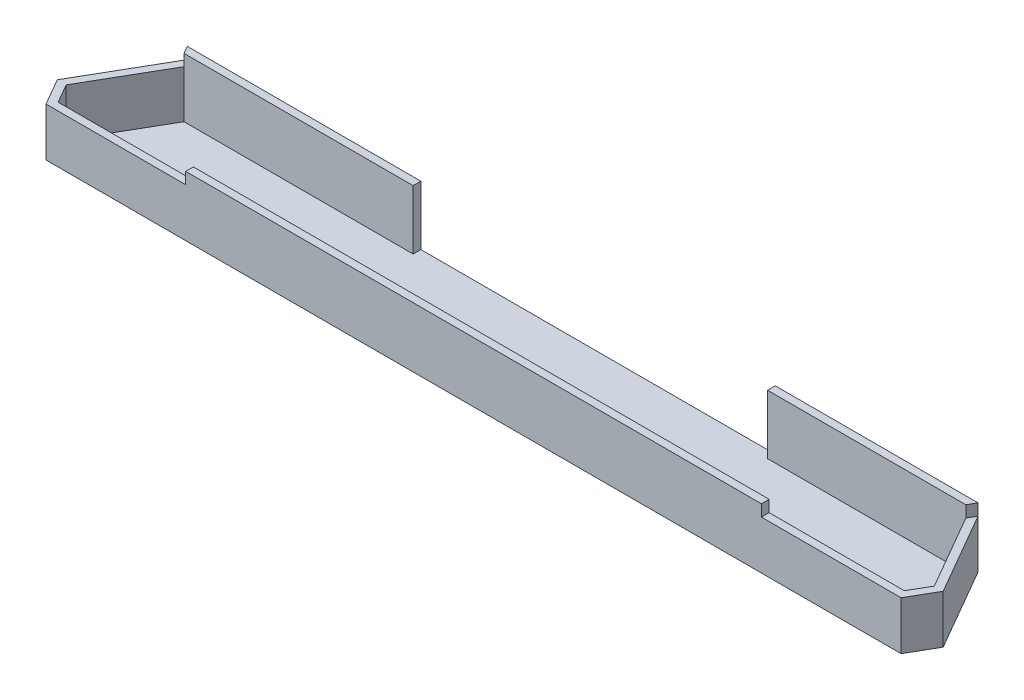
ISO-10303-21;
HEADER;
FILE_DESCRIPTION(('STEP AP214'),'2;1');
FILE_NAME('part.step','',(''),(''),'','','');
FILE_SCHEMA(('AUTOMOTIVE_DESIGN { 1 0 10303 214 1 1 1 1 }'));
ENDSEC;
DATA;
#1=APPLICATION_CONTEXT('core data for automotive mechanical design processes');
#2=APPLICATION_PROTOCOL_DEFINITION('international standard','automotive_design',2000,#1);
#3=PRODUCT_CONTEXT('',#1,'mechanical');
#4=PRODUCT('Part','Part','',(#3));
#5=PRODUCT_RELATED_PRODUCT_CATEGORY('part','',(#4));
#6=PRODUCT_DEFINITION_FORMATION('','',#4);
#7=PRODUCT_DEFINITION_CONTEXT('part definition',#1,'design');
#8=PRODUCT_DEFINITION('design','',#6,#7);
#9=PRODUCT_DEFINITION_SHAPE('','',#8);
#10=(LENGTH_UNIT() NAMED_UNIT(*) SI_UNIT(.MILLI.,.METRE.));
#11=(NAMED_UNIT(*) PLANE_ANGLE_UNIT() SI_UNIT($,.RADIAN.));
#12=(NAMED_UNIT(*) SI_UNIT($,.STERADIAN.) SOLID_ANGLE_UNIT());
#13=UNCERTAINTY_MEASURE_WITH_UNIT(LENGTH_MEASURE(1.E-05),#10,'distance_accuracy_value','');
#14=(GEOMETRIC_REPRESENTATION_CONTEXT(3) GLOBAL_UNCERTAINTY_ASSIGNED_CONTEXT((#13)) GLOBAL_UNIT_ASSIGNED_CONTEXT((#10,
#11,#12)) REPRESENTATION_CONTEXT('',''));
#15=CARTESIAN_POINT('',(0.,0.,0.));
#16=DIRECTION('',(0.,0.,1.));
#17=DIRECTION('',(1.,0.,0.));
#18=AXIS2_PLACEMENT_3D('',#15,#16,#17);
#19=CARTESIAN_POINT('',(0.,0.2,-21.3917967697248));
#20=DIRECTION('',(0.,0.,-1.));
#21=DIRECTION('',(-1.,0.,0.));
#22=AXIS2_PLACEMENT_3D('',#19,#20,#21);
#23=PLANE('',#22);
#24=DIRECTION('',(1.,0.,0.));
#25=VECTOR('',#24,1.);
#26=CARTESIAN_POINT('',(0.,0.,-21.3917967697248));
#27=LINE('',#26,#25);
#28=CARTESIAN_POINT('',(-102.649440376549,0.,-21.3917967697245));
#29=VERTEX_POINT('',#28);
#30=CARTESIAN_POINT('',(102.649440376549,0.,-21.3917967697245));
#31=VERTEX_POINT('',#30);
#32=EDGE_CURVE('E40',#29,#31,#27,.T.);
#33=ORIENTED_EDGE('',*,*,#32,.F.);
#34=DIRECTION('',(0.,-1.,0.));
#35=VECTOR('',#34,1.);
#36=CARTESIAN_POINT('',(-102.649440376549,12.58,-21.3917967697245));
#37=LINE('',#36,#35);
#38=CARTESIAN_POINT('',(-102.649440376549,12.58,-21.3917967697245));
#39=VERTEX_POINT('',#38);
#40=EDGE_CURVE('E336',#39,#29,#37,.T.);
#41=ORIENTED_EDGE('',*,*,#40,.F.);
#42=DIRECTION('',(0.,-1.,0.));
#43=VECTOR('',#42,1.);
#44=CARTESIAN_POINT('',(-102.649440376549,15.58,-21.3917967697245));
#45=LINE('',#44,#43);
#46=CARTESIAN_POINT('',(-102.649440376549,15.58,-21.3917967697245));
#47=VERTEX_POINT('',#46);
#48=EDGE_CURVE('E383',#47,#39,#45,.T.);
#49=ORIENTED_EDGE('',*,*,#48,.F.);
#50=DIRECTION('',(1.,0.,0.));
#51=VECTOR('',#50,1.);
#52=CARTESIAN_POINT('',(-1.05256950145408E-13,15.58,-21.391796769725));
#53=LINE('',#52,#51);
#54=CARTESIAN_POINT('',(-42.01,15.58,-21.3917967697248));
#55=VERTEX_POINT('',#54);
#56=EDGE_CURVE('E204',#47,#55,#53,.T.);
#57=ORIENTED_EDGE('',*,*,#56,.T.);
#58=DIRECTION('',(0.,-1.,0.));
#59=VECTOR('',#58,1.);
#60=CARTESIAN_POINT('',(-42.01,15.58,-21.3917967697248));
#61=LINE('',#60,#59);
#62=CARTESIAN_POINT('',(-42.01,0.2,-21.3917967697248));
#63=VERTEX_POINT('',#62);
#64=EDGE_CURVE('E216',#55,#63,#61,.T.);
#65=ORIENTED_EDGE('',*,*,#64,.T.);
#66=DIRECTION('',(1.,0.,0.));
#67=VECTOR('',#66,1.);
#68=CARTESIAN_POINT('',(0.,0.2,-21.3917967697248));
#69=LINE('',#68,#67);
#70=CARTESIAN_POINT('',(50.01,0.200000000000001,-21.3917967697248));
#71=VERTEX_POINT('',#70);
#72=EDGE_CURVE('E347',#63,#71,#69,.T.);
#73=ORIENTED_EDGE('',*,*,#72,.T.);
#74=DIRECTION('',(0.,-1.,0.));
#75=VECTOR('',#74,1.);
#76=CARTESIAN_POINT('',(50.01,15.58,-21.3917967697248));
#77=LINE('',#76,#75);
#78=CARTESIAN_POINT('',(50.01,15.58,-21.3917967697248));
#79=VERTEX_POINT('',#78);
#80=EDGE_CURVE('E251',#79,#71,#77,.T.);
#81=ORIENTED_EDGE('',*,*,#80,.F.);
#82=DIRECTION('',(1.,0.,0.));
#83=VECTOR('',#82,1.);
#84=CARTESIAN_POINT('',(1.0997421094056E-13,15.58,-21.3917967697251));
#85=LINE('',#84,#83);
#86=CARTESIAN_POINT('',(102.649440376549,15.58,-21.3917967697245));
#87=VERTEX_POINT('',#86);
#88=EDGE_CURVE('E248',#79,#87,#85,.T.);
#89=ORIENTED_EDGE('',*,*,#88,.T.);
#90=DIRECTION('',(0.,-1.,0.));
#91=VECTOR('',#90,1.);
#92=CARTESIAN_POINT('',(102.649440376549,15.58,-21.3917967697245));
#93=LINE('',#92,#91);
#94=CARTESIAN_POINT('',(102.649440376549,12.58,-21.3917967697245));
#95=VERTEX_POINT('',#94);
#96=EDGE_CURVE('E253',#87,#95,#93,.T.);
#97=ORIENTED_EDGE('',*,*,#96,.T.);
#98=DIRECTION('',(0.,-1.,0.));
#99=VECTOR('',#98,1.);
#100=CARTESIAN_POINT('',(102.649440376549,12.58,-21.3917967697245));
#101=LINE('',#100,#99);
#102=EDGE_CURVE('E297',#95,#31,#101,.T.);
#103=ORIENTED_EDGE('',*,*,#102,.T.);
#104=EDGE_LOOP('',(#33,#41,#49,#57,#65,#73,#81,#89,#97,#103));
#105=FACE_BOUND('',#104,.T.);
#106=ADVANCED_FACE('F37',(#105),#23,.T.);
#107=CARTESIAN_POINT('',(0.,0.2,0.));
#108=DIRECTION('',(0.,1.,0.));
#109=DIRECTION('',(0.,0.,1.));
#110=AXIS2_PLACEMENT_3D('',#107,#108,#109);
#111=PLANE('',#110);
#112=ORIENTED_EDGE('',*,*,#72,.F.);
#113=DIRECTION('',(0.,0.,1.));
#114=VECTOR('',#113,1.);
#115=CARTESIAN_POINT('',(-42.0099999999996,0.2,7.28757332257721E-13));
#116=LINE('',#115,#114);
#117=CARTESIAN_POINT('',(-42.01,0.2,-19.3917967697245));
#118=VERTEX_POINT('',#117);
#119=EDGE_CURVE('E350',#63,#118,#116,.T.);
#120=ORIENTED_EDGE('',*,*,#119,.T.);
#121=DIRECTION('',(1.,0.,0.));
#122=VECTOR('',#121,1.);
#123=CARTESIAN_POINT('',(0.,0.2,-19.3917967697245));
#124=LINE('',#123,#122);
#125=CARTESIAN_POINT('',(-101.49473983817,0.200000000000001,-19.3917967697245));
#126=VERTEX_POINT('',#125);
#127=EDGE_CURVE('E352',#126,#118,#124,.T.);
#128=ORIENTED_EDGE('',*,*,#127,.F.);
#129=DIRECTION('',(0.500000000000004,0.,-0.866025403784436));
#130=VECTOR('',#129,1.);
#131=CARTESIAN_POINT('',(-84.5179491924306,0.2,-48.7964607176055));
#132=LINE('',#131,#130);
#133=CARTESIAN_POINT('',(-112.690598923241,0.200000000000001,0.));
#134=VERTEX_POINT('',#133);
#135=EDGE_CURVE('E354',#134,#126,#132,.T.);
#136=ORIENTED_EDGE('',*,*,#135,.F.);
#137=DIRECTION('',(0.499999999999998,0.,0.86602540378444));
#138=VECTOR('',#137,1.);
#139=CARTESIAN_POINT('',(-84.5179491924314,0.2,48.7964607176051));
#140=LINE('',#139,#138);
#141=CARTESIAN_POINT('',(-109.845299461621,0.200000000000001,4.92820323027554));
#142=VERTEX_POINT('',#141);
#143=EDGE_CURVE('E356',#134,#142,#140,.T.);
#144=ORIENTED_EDGE('',*,*,#143,.T.);
#145=DIRECTION('',(1.,0.,0.));
#146=VECTOR('',#145,1.);
#147=CARTESIAN_POINT('',(0.,0.2,4.92820323027551));
#148=LINE('',#147,#146);
#149=CARTESIAN_POINT('',(109.845299461621,0.2,4.92820323027552));
#150=VERTEX_POINT('',#149);
#151=EDGE_CURVE('E57',#142,#150,#148,.T.);
#152=ORIENTED_EDGE('',*,*,#151,.T.);
#153=DIRECTION('',(-0.500000000000268,0.,0.866025403784284));
#154=VECTOR('',#153,1.);
#155=CARTESIAN_POINT('',(84.5179491924025,0.2,48.7964607176236));
#156=LINE('',#155,#154);
#157=CARTESIAN_POINT('',(112.690598923244,0.2,0.));
#158=VERTEX_POINT('',#157);
#159=EDGE_CURVE('E52',#158,#150,#156,.T.);
#160=ORIENTED_EDGE('',*,*,#159,.F.);
#161=DIRECTION('',(0.500000000000073,0.,0.866025403784397));
#162=VECTOR('',#161,1.);
#163=CARTESIAN_POINT('',(84.5179491924244,0.2,-48.7964607176109));
#164=LINE('',#163,#162);
#165=CARTESIAN_POINT('',(101.49473983817,0.200000000000001,-19.3917967697245));
#166=VERTEX_POINT('',#165);
#167=EDGE_CURVE('E360',#166,#158,#164,.T.);
#168=ORIENTED_EDGE('',*,*,#167,.F.);
#169=DIRECTION('',(-1.,0.,0.));
#170=VECTOR('',#169,1.);
#171=CARTESIAN_POINT('',(3.56748722847581E-13,0.2,-19.3917967697263));
#172=LINE('',#171,#170);
#173=CARTESIAN_POINT('',(50.01,0.200000000000001,-19.3917967697254));
#174=VERTEX_POINT('',#173);
#175=EDGE_CURVE('E45',#166,#174,#172,.T.);
#176=ORIENTED_EDGE('',*,*,#175,.T.);
#177=DIRECTION('',(0.,0.,-1.));
#178=VECTOR('',#177,1.);
#179=CARTESIAN_POINT('',(50.01,0.2,0.));
#180=LINE('',#179,#178);
#181=EDGE_CURVE('E11',#174,#71,#180,.T.);
#182=ORIENTED_EDGE('',*,*,#181,.T.);
#183=EDGE_LOOP('',(#112,#120,#128,#136,#144,#152,#160,#168,#176,#182));
#184=FACE_BOUND('',#183,.T.);
#185=ADVANCED_FACE('F363',(#184),#111,.T.);
#186=CARTESIAN_POINT('',(0.,0.,0.));
#187=DIRECTION('',(0.,1.,0.));
#188=DIRECTION('',(0.,0.,1.));
#189=AXIS2_PLACEMENT_3D('',#186,#187,#188);
#190=PLANE('',#189);
#191=ORIENTED_EDGE('',*,*,#32,.T.);
#192=DIRECTION('',(0.500000000000021,0.,0.866025403784426));
#193=VECTOR('',#192,1.);
#194=CARTESIAN_POINT('',(86.2499999999976,0.,-49.7964607176066));
#195=LINE('',#194,#193);
#196=CARTESIAN_POINT('',(115.,0.,0.));
#197=VERTEX_POINT('',#196);
#198=EDGE_CURVE('E266',#31,#197,#195,.T.);
#199=ORIENTED_EDGE('',*,*,#198,.T.);
#200=DIRECTION('',(-0.5,0.,0.866025403784439));
#201=VECTOR('',#200,1.);
#202=CARTESIAN_POINT('',(86.25,0.,49.7964607176052));
#203=LINE('',#202,#201);
#204=CARTESIAN_POINT('',(111.,0.,6.92820323027546));
#205=VERTEX_POINT('',#204);
#206=EDGE_CURVE('E261',#197,#205,#203,.T.);
#207=ORIENTED_EDGE('',*,*,#206,.T.);
#208=DIRECTION('',(1.,0.,0.));
#209=VECTOR('',#208,1.);
#210=CARTESIAN_POINT('',(0.,0.,6.92820323027568));
#211=LINE('',#210,#209);
#212=CARTESIAN_POINT('',(-111.,0.,6.92820323027546));
#213=VERTEX_POINT('',#212);
#214=EDGE_CURVE('E305',#213,#205,#211,.T.);
#215=ORIENTED_EDGE('',*,*,#214,.F.);
#216=DIRECTION('',(0.500000000000015,0.,0.86602540378443));
#217=VECTOR('',#216,1.);
#218=CARTESIAN_POINT('',(-86.2499999999982,0.,49.7964607176063));
#219=LINE('',#218,#217);
#220=CARTESIAN_POINT('',(-115.,0.,0.));
#221=VERTEX_POINT('',#220);
#222=EDGE_CURVE('E309',#221,#213,#219,.T.);
#223=ORIENTED_EDGE('',*,*,#222,.F.);
#224=DIRECTION('',(0.50000000000002,0.,-0.866025403784427));
#225=VECTOR('',#224,1.);
#226=CARTESIAN_POINT('',(-86.2499999999977,0.,-49.7964607176066));
#227=LINE('',#226,#225);
#228=EDGE_CURVE('E328',#221,#29,#227,.T.);
#229=ORIENTED_EDGE('',*,*,#228,.T.);
#230=EDGE_LOOP('',(#191,#199,#207,#215,#223,#229));
#231=FACE_BOUND('',#230,.T.);
#232=ADVANCED_FACE('F393',(#231),#190,.F.);
#233=CARTESIAN_POINT('',(0.,12.58,6.92820323027568));
#234=DIRECTION('',(0.,0.,-1.));
#235=DIRECTION('',(-1.,0.,0.));
#236=AXIS2_PLACEMENT_3D('',#233,#234,#235);
#237=PLANE('',#236);
#238=ORIENTED_EDGE('',*,*,#214,.T.);
#239=DIRECTION('',(0.,-1.,0.));
#240=VECTOR('',#239,1.);
#241=CARTESIAN_POINT('',(111.,12.58,6.92820323027546));
#242=LINE('',#241,#240);
#243=CARTESIAN_POINT('',(111.,12.58,6.92820323027546));
#244=VERTEX_POINT('',#243);
#245=EDGE_CURVE('E302',#244,#205,#242,.T.);
#246=ORIENTED_EDGE('',*,*,#245,.F.);
#247=DIRECTION('',(-1.,0.,0.));
#248=VECTOR('',#247,1.);
#249=CARTESIAN_POINT('',(0.,12.58,6.92820323027567));
#250=LINE('',#249,#248);
#251=CARTESIAN_POINT('',(74.74,12.58,6.92820323027553));
#252=VERTEX_POINT('',#251);
#253=EDGE_CURVE('E265',#244,#252,#250,.T.);
#254=ORIENTED_EDGE('',*,*,#253,.T.);
#255=DIRECTION('',(0.,-1.,0.));
#256=VECTOR('',#255,1.);
#257=CARTESIAN_POINT('',(74.74,15.58,6.92820323027553));
#258=LINE('',#257,#256);
#259=CARTESIAN_POINT('',(74.74,15.58,6.92820323027553));
#260=VERTEX_POINT('',#259);
#261=EDGE_CURVE('E236',#260,#252,#258,.T.);
#262=ORIENTED_EDGE('',*,*,#261,.F.);
#263=DIRECTION('',(-1.,0.,0.));
#264=VECTOR('',#263,1.);
#265=CARTESIAN_POINT('',(0.,15.58,6.92820323027553));
#266=LINE('',#265,#264);
#267=CARTESIAN_POINT('',(-74.74,15.58,6.92820323027553));
#268=VERTEX_POINT('',#267);
#269=EDGE_CURVE('E211',#260,#268,#266,.T.);
#270=ORIENTED_EDGE('',*,*,#269,.T.);
#271=DIRECTION('',(0.,-1.,0.));
#272=VECTOR('',#271,1.);
#273=CARTESIAN_POINT('',(-74.74,15.58,6.92820323027553));
#274=LINE('',#273,#272);
#275=CARTESIAN_POINT('',(-74.74,12.58,6.92820323027553));
#276=VERTEX_POINT('',#275);
#277=EDGE_CURVE('E227',#268,#276,#274,.T.);
#278=ORIENTED_EDGE('',*,*,#277,.T.);
#279=DIRECTION('',(1.,0.,0.));
#280=VECTOR('',#279,1.);
#281=CARTESIAN_POINT('',(0.,12.58,6.92820323027568));
#282=LINE('',#281,#280);
#283=CARTESIAN_POINT('',(-111.,12.58,6.92820323027546));
#284=VERTEX_POINT('',#283);
#285=EDGE_CURVE('E306',#284,#276,#282,.T.);
#286=ORIENTED_EDGE('',*,*,#285,.F.);
#287=DIRECTION('',(0.,-1.,0.));
#288=VECTOR('',#287,1.);
#289=CARTESIAN_POINT('',(-111.,12.58,6.92820323027546));
#290=LINE('',#289,#288);
#291=EDGE_CURVE('E326',#284,#213,#290,.T.);
#292=ORIENTED_EDGE('',*,*,#291,.T.);
#293=EDGE_LOOP('',(#238,#246,#254,#262,#270,#278,#286,#292));
#294=FACE_BOUND('',#293,.T.);
#295=ADVANCED_FACE('F401',(#294),#237,.F.);
#296=CARTESIAN_POINT('',(0.,12.58,4.92820323027551));
#297=DIRECTION('',(0.,0.,-1.));
#298=DIRECTION('',(-1.,0.,0.));
#299=AXIS2_PLACEMENT_3D('',#296,#297,#298);
#300=PLANE('',#299);
#301=DIRECTION('',(1.,0.,0.));
#302=VECTOR('',#301,1.);
#303=CARTESIAN_POINT('',(0.,12.58,4.92820323027551));
#304=LINE('',#303,#302);
#305=CARTESIAN_POINT('',(-109.845299461621,12.58,4.92820323027554));
#306=VERTEX_POINT('',#305);
#307=CARTESIAN_POINT('',(-74.74,12.58,4.92820323027553));
#308=VERTEX_POINT('',#307);
#309=EDGE_CURVE('E311',#306,#308,#304,.T.);
#310=ORIENTED_EDGE('',*,*,#309,.T.);
#311=DIRECTION('',(0.,-1.,0.));
#312=VECTOR('',#311,1.);
#313=CARTESIAN_POINT('',(-74.74,15.58,4.92820323027553));
#314=LINE('',#313,#312);
#315=CARTESIAN_POINT('',(-74.74,15.58,4.92820323027553));
#316=VERTEX_POINT('',#315);
#317=EDGE_CURVE('E230',#316,#308,#314,.T.);
#318=ORIENTED_EDGE('',*,*,#317,.F.);
#319=DIRECTION('',(1.,0.,0.));
#320=VECTOR('',#319,1.);
#321=CARTESIAN_POINT('',(0.,15.58,4.92820323027553));
#322=LINE('',#321,#320);
#323=CARTESIAN_POINT('',(74.74,15.58,4.92820323027553));
#324=VERTEX_POINT('',#323);
#325=EDGE_CURVE('E221',#316,#324,#322,.T.);
#326=ORIENTED_EDGE('',*,*,#325,.T.);
#327=DIRECTION('',(0.,-1.,0.));
#328=VECTOR('',#327,1.);
#329=CARTESIAN_POINT('',(74.74,15.58,4.92820323027553));
#330=LINE('',#329,#328);
#331=CARTESIAN_POINT('',(74.74,12.58,4.92820323027553));
#332=VERTEX_POINT('',#331);
#333=EDGE_CURVE('E233',#324,#332,#330,.T.);
#334=ORIENTED_EDGE('',*,*,#333,.T.);
#335=DIRECTION('',(-1.,0.,0.));
#336=VECTOR('',#335,1.);
#337=CARTESIAN_POINT('',(0.,12.58,4.92820323027554));
#338=LINE('',#337,#336);
#339=CARTESIAN_POINT('',(109.845299461621,12.58,4.92820323027552));
#340=VERTEX_POINT('',#339);
#341=EDGE_CURVE('E282',#340,#332,#338,.T.);
#342=ORIENTED_EDGE('',*,*,#341,.F.);
#343=DIRECTION('',(0.,-1.,0.));
#344=VECTOR('',#343,1.);
#345=CARTESIAN_POINT('',(109.845299461621,12.58,4.92820323027552));
#346=LINE('',#345,#344);
#347=EDGE_CURVE('E284',#340,#150,#346,.T.);
#348=ORIENTED_EDGE('',*,*,#347,.T.);
#349=ORIENTED_EDGE('',*,*,#151,.F.);
#350=DIRECTION('',(0.,-1.,0.));
#351=VECTOR('',#350,1.);
#352=CARTESIAN_POINT('',(-109.845299461621,12.58,4.92820323027554));
#353=LINE('',#352,#351);
#354=EDGE_CURVE('E344',#306,#142,#353,.T.);
#355=ORIENTED_EDGE('',*,*,#354,.F.);
#356=EDGE_LOOP('',(#310,#318,#326,#334,#342,#348,#349,#355));
#357=FACE_BOUND('',#356,.T.);
#358=ADVANCED_FACE('F411',(#357),#300,.T.);
#359=CARTESIAN_POINT('',(-84.5179491924314,12.58,48.7964607176051));
#360=DIRECTION('',(0.86602540378444,0.,-0.499999999999998));
#361=DIRECTION('',(-0.499999999999998,0.,-0.86602540378444));
#362=AXIS2_PLACEMENT_3D('',#359,#360,#361);
#363=PLANE('',#362);
#364=ORIENTED_EDGE('',*,*,#354,.T.);
#365=ORIENTED_EDGE('',*,*,#143,.F.);
#366=DIRECTION('',(0.,-1.,0.));
#367=VECTOR('',#366,1.);
#368=CARTESIAN_POINT('',(-112.690598923241,12.58,0.));
#369=LINE('',#368,#367);
#370=CARTESIAN_POINT('',(-112.690598923241,12.58,0.));
#371=VERTEX_POINT('',#370);
#372=EDGE_CURVE('E341',#371,#134,#369,.T.);
#373=ORIENTED_EDGE('',*,*,#372,.F.);
#374=DIRECTION('',(0.499999999999998,0.,0.86602540378444));
#375=VECTOR('',#374,1.);
#376=CARTESIAN_POINT('',(-84.5179491924314,12.58,48.7964607176051));
#377=LINE('',#376,#375);
#378=EDGE_CURVE('E314',#371,#306,#377,.T.);
#379=ORIENTED_EDGE('',*,*,#378,.T.);
#380=EDGE_LOOP('',(#364,#365,#373,#379));
#381=FACE_BOUND('',#380,.T.);
#382=ADVANCED_FACE('F455',(#381),#363,.T.);
#383=CARTESIAN_POINT('',(-84.5179491924306,12.58,-48.7964607176055));
#384=DIRECTION('',(-0.866025403784436,0.,-0.500000000000004));
#385=DIRECTION('',(-0.500000000000004,0.,0.866025403784436));
#386=AXIS2_PLACEMENT_3D('',#383,#384,#385);
#387=PLANE('',#386);
#388=ORIENTED_EDGE('',*,*,#135,.T.);
#389=DIRECTION('',(0.,-1.,0.));
#390=VECTOR('',#389,1.);
#391=CARTESIAN_POINT('',(-101.49473983817,12.58,-19.3917967697245));
#392=LINE('',#391,#390);
#393=CARTESIAN_POINT('',(-101.49473983817,12.58,-19.3917967697245));
#394=VERTEX_POINT('',#393);
#395=EDGE_CURVE('E339',#394,#126,#392,.T.);
#396=ORIENTED_EDGE('',*,*,#395,.F.);
#397=DIRECTION('',(0.500000000000004,0.,-0.866025403784436));
#398=VECTOR('',#397,1.);
#399=CARTESIAN_POINT('',(-84.5179491924306,12.58,-48.7964607176055));
#400=LINE('',#399,#398);
#401=EDGE_CURVE('E317',#371,#394,#400,.T.);
#402=ORIENTED_EDGE('',*,*,#401,.F.);
#403=ORIENTED_EDGE('',*,*,#372,.T.);
#404=EDGE_LOOP('',(#388,#396,#402,#403));
#405=FACE_BOUND('',#404,.T.);
#406=ADVANCED_FACE('F458',(#405),#387,.F.);
#407=CARTESIAN_POINT('',(-86.2499999999977,12.58,-49.7964607176066));
#408=DIRECTION('',(-0.866025403784427,0.,-0.50000000000002));
#409=DIRECTION('',(-0.50000000000002,0.,0.866025403784427));
#410=AXIS2_PLACEMENT_3D('',#407,#408,#409);
#411=PLANE('',#410);
#412=ORIENTED_EDGE('',*,*,#228,.F.);
#413=DIRECTION('',(0.,-1.,0.));
#414=VECTOR('',#413,1.);
#415=CARTESIAN_POINT('',(-115.,12.58,0.));
#416=LINE('',#415,#414);
#417=CARTESIAN_POINT('',(-115.,12.58,0.));
#418=VERTEX_POINT('',#417);
#419=EDGE_CURVE('E334',#418,#221,#416,.T.);
#420=ORIENTED_EDGE('',*,*,#419,.F.);
#421=DIRECTION('',(0.50000000000002,0.,-0.866025403784427));
#422=VECTOR('',#421,1.);
#423=CARTESIAN_POINT('',(-86.2499999999977,12.58,-49.7964607176066));
#424=LINE('',#423,#422);
#425=EDGE_CURVE('E321',#418,#39,#424,.T.);
#426=ORIENTED_EDGE('',*,*,#425,.T.);
#427=ORIENTED_EDGE('',*,*,#40,.T.);
#428=EDGE_LOOP('',(#412,#420,#426,#427));
#429=FACE_BOUND('',#428,.T.);
#430=ADVANCED_FACE('F389',(#429),#411,.T.);
#431=CARTESIAN_POINT('',(-86.2499999999982,12.58,49.7964607176063));
#432=DIRECTION('',(0.86602540378443,0.,-0.500000000000015));
#433=DIRECTION('',(-0.500000000000015,0.,-0.86602540378443));
#434=AXIS2_PLACEMENT_3D('',#431,#432,#433);
#435=PLANE('',#434);
#436=ORIENTED_EDGE('',*,*,#222,.T.);
#437=ORIENTED_EDGE('',*,*,#291,.F.);
#438=DIRECTION('',(0.500000000000015,0.,0.86602540378443));
#439=VECTOR('',#438,1.);
#440=CARTESIAN_POINT('',(-86.2499999999982,12.58,49.7964607176063));
#441=LINE('',#440,#439);
#442=EDGE_CURVE('E324',#418,#284,#441,.T.);
#443=ORIENTED_EDGE('',*,*,#442,.F.);
#444=ORIENTED_EDGE('',*,*,#419,.T.);
#445=EDGE_LOOP('',(#436,#437,#443,#444));
#446=FACE_BOUND('',#445,.T.);
#447=ADVANCED_FACE('F397',(#446),#435,.F.);
#448=CARTESIAN_POINT('',(0.,12.58,0.));
#449=DIRECTION('',(0.,1.,0.));
#450=DIRECTION('',(0.,0.,1.));
#451=AXIS2_PLACEMENT_3D('',#448,#449,#450);
#452=PLANE('',#451);
#453=ORIENTED_EDGE('',*,*,#285,.T.);
#454=DIRECTION('',(0.,0.,-1.));
#455=VECTOR('',#454,1.);
#456=CARTESIAN_POINT('',(-74.74,12.58,0.));
#457=LINE('',#456,#455);
#458=EDGE_CURVE('E308',#276,#308,#457,.T.);
#459=ORIENTED_EDGE('',*,*,#458,.T.);
#460=ORIENTED_EDGE('',*,*,#309,.F.);
#461=ORIENTED_EDGE('',*,*,#378,.F.);
#462=ORIENTED_EDGE('',*,*,#401,.T.);
#463=DIRECTION('',(0.499999999999805,0.,0.866025403784551));
#464=VECTOR('',#463,1.);
#465=CARTESIAN_POINT('',(-67.7241605648466,12.58,39.1005623327353));
#466=LINE('',#465,#464);
#467=EDGE_CURVE('E210',#39,#394,#466,.T.);
#468=ORIENTED_EDGE('',*,*,#467,.F.);
#469=ORIENTED_EDGE('',*,*,#425,.F.);
#470=ORIENTED_EDGE('',*,*,#442,.T.);
#471=EDGE_LOOP('',(#453,#459,#460,#461,#462,#468,#469,#470));
#472=FACE_BOUND('',#471,.T.);
#473=ADVANCED_FACE('F404',(#472),#452,.T.);
#474=CARTESIAN_POINT('',(86.25,12.58,49.7964607176052));
#475=DIRECTION('',(0.866025403784439,0.,0.5));
#476=DIRECTION('',(0.5,0.,-0.866025403784439));
#477=AXIS2_PLACEMENT_3D('',#474,#475,#476);
#478=PLANE('',#477);
#479=ORIENTED_EDGE('',*,*,#206,.F.);
#480=DIRECTION('',(0.,-1.,0.));
#481=VECTOR('',#480,1.);
#482=CARTESIAN_POINT('',(115.,12.58,0.));
#483=LINE('',#482,#481);
#484=CARTESIAN_POINT('',(115.,12.58,0.));
#485=VERTEX_POINT('',#484);
#486=EDGE_CURVE('E300',#485,#197,#483,.T.);
#487=ORIENTED_EDGE('',*,*,#486,.F.);
#488=DIRECTION('',(-0.5,0.,0.866025403784439));
#489=VECTOR('',#488,1.);
#490=CARTESIAN_POINT('',(86.25,12.58,49.7964607176052));
#491=LINE('',#490,#489);
#492=EDGE_CURVE('E269',#485,#244,#491,.T.);
#493=ORIENTED_EDGE('',*,*,#492,.T.);
#494=ORIENTED_EDGE('',*,*,#245,.T.);
#495=EDGE_LOOP('',(#479,#487,#493,#494));
#496=FACE_BOUND('',#495,.T.);
#497=ADVANCED_FACE('F439',(#496),#478,.T.);
#498=CARTESIAN_POINT('',(86.2499999999976,12.58,-49.7964607176066));
#499=DIRECTION('',(0.866025403784426,0.,-0.500000000000021));
#500=DIRECTION('',(-0.500000000000021,0.,-0.866025403784426));
#501=AXIS2_PLACEMENT_3D('',#498,#499,#500);
#502=PLANE('',#501);
#503=ORIENTED_EDGE('',*,*,#198,.F.);
#504=ORIENTED_EDGE('',*,*,#102,.F.);
#505=DIRECTION('',(0.500000000000021,0.,0.866025403784426));
#506=VECTOR('',#505,1.);
#507=CARTESIAN_POINT('',(86.2499999999976,12.58,-49.7964607176066));
#508=LINE('',#507,#506);
#509=EDGE_CURVE('E272',#95,#485,#508,.T.);
#510=ORIENTED_EDGE('',*,*,#509,.T.);
#511=ORIENTED_EDGE('',*,*,#486,.T.);
#512=EDGE_LOOP('',(#503,#504,#510,#511));
#513=FACE_BOUND('',#512,.T.);
#514=ADVANCED_FACE('F432',(#513),#502,.T.);
#515=CARTESIAN_POINT('',(84.5179491924244,12.58,-48.7964607176109));
#516=DIRECTION('',(0.866025403784396,0.,-0.500000000000073));
#517=DIRECTION('',(-0.500000000000073,0.,-0.866025403784397));
#518=AXIS2_PLACEMENT_3D('',#515,#516,#517);
#519=PLANE('',#518);
#520=ORIENTED_EDGE('',*,*,#167,.T.);
#521=DIRECTION('',(0.,-1.,0.));
#522=VECTOR('',#521,1.);
#523=CARTESIAN_POINT('',(112.690598923244,12.58,0.));
#524=LINE('',#523,#522);
#525=CARTESIAN_POINT('',(112.690598923244,12.58,0.));
#526=VERTEX_POINT('',#525);
#527=EDGE_CURVE('E291',#526,#158,#524,.T.);
#528=ORIENTED_EDGE('',*,*,#527,.F.);
#529=DIRECTION('',(0.500000000000073,0.,0.866025403784397));
#530=VECTOR('',#529,1.);
#531=CARTESIAN_POINT('',(84.5179491924244,12.58,-48.7964607176109));
#532=LINE('',#531,#530);
#533=CARTESIAN_POINT('',(101.49473983817,12.58,-19.3917967697245));
#534=VERTEX_POINT('',#533);
#535=EDGE_CURVE('E278',#534,#526,#532,.T.);
#536=ORIENTED_EDGE('',*,*,#535,.F.);
#537=DIRECTION('',(0.,-1.,0.));
#538=VECTOR('',#537,1.);
#539=CARTESIAN_POINT('',(101.49473983817,12.58,-19.3917967697245));
#540=LINE('',#539,#538);
#541=EDGE_CURVE('E294',#534,#166,#540,.T.);
#542=ORIENTED_EDGE('',*,*,#541,.T.);
#543=EDGE_LOOP('',(#520,#528,#536,#542));
#544=FACE_BOUND('',#543,.T.);
#545=ADVANCED_FACE('F430',(#544),#519,.F.);
#546=CARTESIAN_POINT('',(84.5179491924025,12.58,48.7964607176236));
#547=DIRECTION('',(0.866025403784284,0.,0.500000000000268));
#548=DIRECTION('',(0.500000000000268,0.,-0.866025403784284));
#549=AXIS2_PLACEMENT_3D('',#546,#547,#548);
#550=PLANE('',#549);
#551=ORIENTED_EDGE('',*,*,#159,.T.);
#552=ORIENTED_EDGE('',*,*,#347,.F.);
#553=DIRECTION('',(-0.500000000000268,0.,0.866025403784284));
#554=VECTOR('',#553,1.);
#555=CARTESIAN_POINT('',(84.5179491924025,12.58,48.7964607176236));
#556=LINE('',#555,#554);
#557=EDGE_CURVE('E280',#526,#340,#556,.T.);
#558=ORIENTED_EDGE('',*,*,#557,.F.);
#559=ORIENTED_EDGE('',*,*,#527,.T.);
#560=EDGE_LOOP('',(#551,#552,#558,#559));
#561=FACE_BOUND('',#560,.T.);
#562=ADVANCED_FACE('F428',(#561),#550,.F.);
#563=CARTESIAN_POINT('',(0.,12.58,0.));
#564=DIRECTION('',(0.,1.,0.));
#565=DIRECTION('',(0.,0.,1.));
#566=AXIS2_PLACEMENT_3D('',#563,#564,#565);
#567=PLANE('',#566);
#568=DIRECTION('',(0.,0.,-1.));
#569=VECTOR('',#568,1.);
#570=CARTESIAN_POINT('',(74.74,12.58,0.));
#571=LINE('',#570,#569);
#572=EDGE_CURVE('E262',#252,#332,#571,.T.);
#573=ORIENTED_EDGE('',*,*,#572,.F.);
#574=ORIENTED_EDGE('',*,*,#253,.F.);
#575=ORIENTED_EDGE('',*,*,#492,.F.);
#576=ORIENTED_EDGE('',*,*,#509,.F.);
#577=DIRECTION('',(-0.499999999999803,0.,0.866025403784552));
#578=VECTOR('',#577,1.);
#579=CARTESIAN_POINT('',(67.7241605648468,12.58,39.1005623327352));
#580=LINE('',#579,#578);
#581=EDGE_CURVE('E275',#95,#534,#580,.T.);
#582=ORIENTED_EDGE('',*,*,#581,.T.);
#583=ORIENTED_EDGE('',*,*,#535,.T.);
#584=ORIENTED_EDGE('',*,*,#557,.T.);
#585=ORIENTED_EDGE('',*,*,#341,.T.);
#586=EDGE_LOOP('',(#573,#574,#575,#576,#582,#583,#584,#585));
#587=FACE_BOUND('',#586,.T.);
#588=ADVANCED_FACE('F422',(#587),#567,.T.);
#589=CARTESIAN_POINT('',(50.01,15.58,0.));
#590=DIRECTION('',(-1.,0.,0.));
#591=DIRECTION('',(0.,0.,1.));
#592=AXIS2_PLACEMENT_3D('',#589,#590,#591);
#593=PLANE('',#592);
#594=ORIENTED_EDGE('',*,*,#80,.T.);
#595=ORIENTED_EDGE('',*,*,#181,.F.);
#596=DIRECTION('',(0.,-1.,0.));
#597=VECTOR('',#596,1.);
#598=CARTESIAN_POINT('',(50.01,15.58,-19.3917967697254));
#599=LINE('',#598,#597);
#600=CARTESIAN_POINT('',(50.01,15.58,-19.3917967697254));
#601=VERTEX_POINT('',#600);
#602=EDGE_CURVE('E258',#601,#174,#599,.T.);
#603=ORIENTED_EDGE('',*,*,#602,.F.);
#604=DIRECTION('',(0.,0.,-1.));
#605=VECTOR('',#604,1.);
#606=CARTESIAN_POINT('',(50.01,15.58,0.));
#607=LINE('',#606,#605);
#608=EDGE_CURVE('E239',#601,#79,#607,.T.);
#609=ORIENTED_EDGE('',*,*,#608,.T.);
#610=EDGE_LOOP('',(#594,#595,#603,#609));
#611=FACE_BOUND('',#610,.T.);
#612=ADVANCED_FACE('F370',(#611),#593,.T.);
#613=CARTESIAN_POINT('',(3.56748722847581E-13,15.58,-19.3917967697263));
#614=DIRECTION('',(0.,0.,1.));
#615=DIRECTION('',(1.,0.,0.));
#616=AXIS2_PLACEMENT_3D('',#613,#614,#615);
#617=PLANE('',#616);
#618=ORIENTED_EDGE('',*,*,#602,.T.);
#619=ORIENTED_EDGE('',*,*,#175,.F.);
#620=ORIENTED_EDGE('',*,*,#541,.F.);
#621=DIRECTION('',(0.,-1.,0.));
#622=VECTOR('',#621,1.);
#623=CARTESIAN_POINT('',(101.49473983817,15.58,-19.3917967697245));
#624=LINE('',#623,#622);
#625=CARTESIAN_POINT('',(101.49473983817,15.58,-19.3917967697245));
#626=VERTEX_POINT('',#625);
#627=EDGE_CURVE('E256',#626,#534,#624,.T.);
#628=ORIENTED_EDGE('',*,*,#627,.F.);
#629=DIRECTION('',(-1.,0.,0.));
#630=VECTOR('',#629,1.);
#631=CARTESIAN_POINT('',(3.56748722847581E-13,15.58,-19.3917967697263));
#632=LINE('',#631,#630);
#633=EDGE_CURVE('E242',#626,#601,#632,.T.);
#634=ORIENTED_EDGE('',*,*,#633,.T.);
#635=EDGE_LOOP('',(#618,#619,#620,#628,#634));
#636=FACE_BOUND('',#635,.T.);
#637=ADVANCED_FACE('F366',(#636),#617,.T.);
#638=CARTESIAN_POINT('',(67.7241605648468,15.58,39.1005623327352));
#639=DIRECTION('',(0.866025403784552,0.,0.499999999999803));
#640=DIRECTION('',(0.499999999999803,0.,-0.866025403784552));
#641=AXIS2_PLACEMENT_3D('',#638,#639,#640);
#642=PLANE('',#641);
#643=ORIENTED_EDGE('',*,*,#627,.T.);
#644=ORIENTED_EDGE('',*,*,#581,.F.);
#645=ORIENTED_EDGE('',*,*,#96,.F.);
#646=DIRECTION('',(-0.499999999999803,0.,0.866025403784552));
#647=VECTOR('',#646,1.);
#648=CARTESIAN_POINT('',(67.7241605648468,15.58,39.1005623327352));
#649=LINE('',#648,#647);
#650=EDGE_CURVE('E245',#87,#626,#649,.T.);
#651=ORIENTED_EDGE('',*,*,#650,.T.);
#652=EDGE_LOOP('',(#643,#644,#645,#651));
#653=FACE_BOUND('',#652,.T.);
#654=ADVANCED_FACE('F478',(#653),#642,.T.);
#655=CARTESIAN_POINT('',(0.,15.58,0.));
#656=DIRECTION('',(0.,1.,0.));
#657=DIRECTION('',(0.,0.,1.));
#658=AXIS2_PLACEMENT_3D('',#655,#656,#657);
#659=PLANE('',#658);
#660=ORIENTED_EDGE('',*,*,#608,.F.);
#661=ORIENTED_EDGE('',*,*,#633,.F.);
#662=ORIENTED_EDGE('',*,*,#650,.F.);
#663=ORIENTED_EDGE('',*,*,#88,.F.);
#664=EDGE_LOOP('',(#660,#661,#662,#663));
#665=FACE_BOUND('',#664,.T.);
#666=ADVANCED_FACE('F373',(#665),#659,.T.);
#667=CARTESIAN_POINT('',(74.74,15.58,0.));
#668=DIRECTION('',(-1.,0.,0.));
#669=DIRECTION('',(0.,0.,1.));
#670=AXIS2_PLACEMENT_3D('',#667,#668,#669);
#671=PLANE('',#670);
#672=ORIENTED_EDGE('',*,*,#572,.T.);
#673=ORIENTED_EDGE('',*,*,#333,.F.);
#674=DIRECTION('',(0.,0.,-1.));
#675=VECTOR('',#674,1.);
#676=CARTESIAN_POINT('',(74.74,15.58,0.));
#677=LINE('',#676,#675);
#678=EDGE_CURVE('E214',#260,#324,#677,.T.);
#679=ORIENTED_EDGE('',*,*,#678,.F.);
#680=ORIENTED_EDGE('',*,*,#261,.T.);
#681=EDGE_LOOP('',(#672,#673,#679,#680));
#682=FACE_BOUND('',#681,.T.);
#683=ADVANCED_FACE('F418',(#682),#671,.F.);
#684=CARTESIAN_POINT('',(-74.74,15.58,0.));
#685=DIRECTION('',(-1.,0.,0.));
#686=DIRECTION('',(0.,0.,1.));
#687=AXIS2_PLACEMENT_3D('',#684,#685,#686);
#688=PLANE('',#687);
#689=ORIENTED_EDGE('',*,*,#317,.T.);
#690=ORIENTED_EDGE('',*,*,#458,.F.);
#691=ORIENTED_EDGE('',*,*,#277,.F.);
#692=DIRECTION('',(0.,0.,-1.));
#693=VECTOR('',#692,1.);
#694=CARTESIAN_POINT('',(-74.74,15.58,0.));
#695=LINE('',#694,#693);
#696=EDGE_CURVE('E224',#268,#316,#695,.T.);
#697=ORIENTED_EDGE('',*,*,#696,.T.);
#698=EDGE_LOOP('',(#689,#690,#691,#697));
#699=FACE_BOUND('',#698,.T.);
#700=ADVANCED_FACE('F407',(#699),#688,.T.);
#701=CARTESIAN_POINT('',(0.,15.58,0.));
#702=DIRECTION('',(0.,1.,0.));
#703=DIRECTION('',(0.,0.,1.));
#704=AXIS2_PLACEMENT_3D('',#701,#702,#703);
#705=PLANE('',#704);
#706=ORIENTED_EDGE('',*,*,#269,.F.);
#707=ORIENTED_EDGE('',*,*,#678,.T.);
#708=ORIENTED_EDGE('',*,*,#325,.F.);
#709=ORIENTED_EDGE('',*,*,#696,.F.);
#710=EDGE_LOOP('',(#706,#707,#708,#709));
#711=FACE_BOUND('',#710,.T.);
#712=ADVANCED_FACE('F414',(#711),#705,.T.);
#713=CARTESIAN_POINT('',(-67.7241605648466,15.58,39.1005623327353));
#714=DIRECTION('',(0.866025403784551,0.,-0.499999999999805));
#715=DIRECTION('',(-0.499999999999805,0.,-0.866025403784551));
#716=AXIS2_PLACEMENT_3D('',#713,#714,#715);
#717=PLANE('',#716);
#718=ORIENTED_EDGE('',*,*,#467,.T.);
#719=DIRECTION('',(0.,-1.,0.));
#720=VECTOR('',#719,1.);
#721=CARTESIAN_POINT('',(-101.49473983817,15.58,-19.3917967697245));
#722=LINE('',#721,#720);
#723=CARTESIAN_POINT('',(-101.49473983817,15.58,-19.3917967697245));
#724=VERTEX_POINT('',#723);
#725=EDGE_CURVE('E191',#724,#394,#722,.T.);
#726=ORIENTED_EDGE('',*,*,#725,.F.);
#727=DIRECTION('',(0.499999999999805,0.,0.866025403784551));
#728=VECTOR('',#727,1.);
#729=CARTESIAN_POINT('',(-67.7241605648466,15.58,39.1005623327353));
#730=LINE('',#729,#728);
#731=EDGE_CURVE('E198',#47,#724,#730,.T.);
#732=ORIENTED_EDGE('',*,*,#731,.F.);
#733=ORIENTED_EDGE('',*,*,#48,.T.);
#734=EDGE_LOOP('',(#718,#726,#732,#733));
#735=FACE_BOUND('',#734,.T.);
#736=ADVANCED_FACE('F209',(#735),#717,.F.);
#737=CARTESIAN_POINT('',(0.,15.58,-19.3917967697245));
#738=DIRECTION('',(0.,0.,-1.));
#739=DIRECTION('',(-1.,0.,0.));
#740=AXIS2_PLACEMENT_3D('',#737,#738,#739);
#741=PLANE('',#740);
#742=ORIENTED_EDGE('',*,*,#127,.T.);
#743=DIRECTION('',(0.,-1.,0.));
#744=VECTOR('',#743,1.);
#745=CARTESIAN_POINT('',(-42.01,15.58,-19.3917967697245));
#746=LINE('',#745,#744);
#747=CARTESIAN_POINT('',(-42.01,15.58,-19.3917967697245));
#748=VERTEX_POINT('',#747);
#749=EDGE_CURVE('E193',#748,#118,#746,.T.);
#750=ORIENTED_EDGE('',*,*,#749,.F.);
#751=DIRECTION('',(1.,0.,0.));
#752=VECTOR('',#751,1.);
#753=CARTESIAN_POINT('',(0.,15.58,-19.3917967697245));
#754=LINE('',#753,#752);
#755=EDGE_CURVE('E185',#724,#748,#754,.T.);
#756=ORIENTED_EDGE('',*,*,#755,.F.);
#757=ORIENTED_EDGE('',*,*,#725,.T.);
#758=ORIENTED_EDGE('',*,*,#395,.T.);
#759=EDGE_LOOP('',(#742,#750,#756,#757,#758));
#760=FACE_BOUND('',#759,.T.);
#761=ADVANCED_FACE('F188',(#760),#741,.F.);
#762=CARTESIAN_POINT('',(-42.0099999999996,15.58,7.28757332257721E-13));
#763=DIRECTION('',(1.,0.,0.));
#764=DIRECTION('',(0.,0.,-1.));
#765=AXIS2_PLACEMENT_3D('',#762,#763,#764);
#766=PLANE('',#765);
#767=ORIENTED_EDGE('',*,*,#749,.T.);
#768=ORIENTED_EDGE('',*,*,#119,.F.);
#769=ORIENTED_EDGE('',*,*,#64,.F.);
#770=DIRECTION('',(0.,0.,1.));
#771=VECTOR('',#770,1.);
#772=CARTESIAN_POINT('',(-42.0099999999996,15.58,7.28757332257721E-13));
#773=LINE('',#772,#771);
#774=EDGE_CURVE('E197',#55,#748,#773,.T.);
#775=ORIENTED_EDGE('',*,*,#774,.T.);
#776=EDGE_LOOP('',(#767,#768,#769,#775));
#777=FACE_BOUND('',#776,.T.);
#778=ADVANCED_FACE('F381',(#777),#766,.T.);
#779=CARTESIAN_POINT('',(0.,15.58,0.));
#780=DIRECTION('',(0.,1.,0.));
#781=DIRECTION('',(0.,0.,1.));
#782=AXIS2_PLACEMENT_3D('',#779,#780,#781);
#783=PLANE('',#782);
#784=ORIENTED_EDGE('',*,*,#731,.T.);
#785=ORIENTED_EDGE('',*,*,#755,.T.);
#786=ORIENTED_EDGE('',*,*,#774,.F.);
#787=ORIENTED_EDGE('',*,*,#56,.F.);
#788=EDGE_LOOP('',(#784,#785,#786,#787));
#789=FACE_BOUND('',#788,.T.);
#790=ADVANCED_FACE('F202',(#789),#783,.T.);
#791=CLOSED_SHELL('',(#106,#185,#232,#295,#358,#382,#406,#430,#447,#473,#497,#514,#545,#562,
#588,#612,#637,#654,#666,#683,#700,#712,#736,#761,#778,#790));
#792=MANIFOLD_SOLID_BREP('B2',#791);
#793=ADVANCED_BREP_SHAPE_REPRESENTATION('',(#18,#792),#14);
#794=SHAPE_DEFINITION_REPRESENTATION(#9,#793);
ENDSEC;
END-ISO-10303-21;
